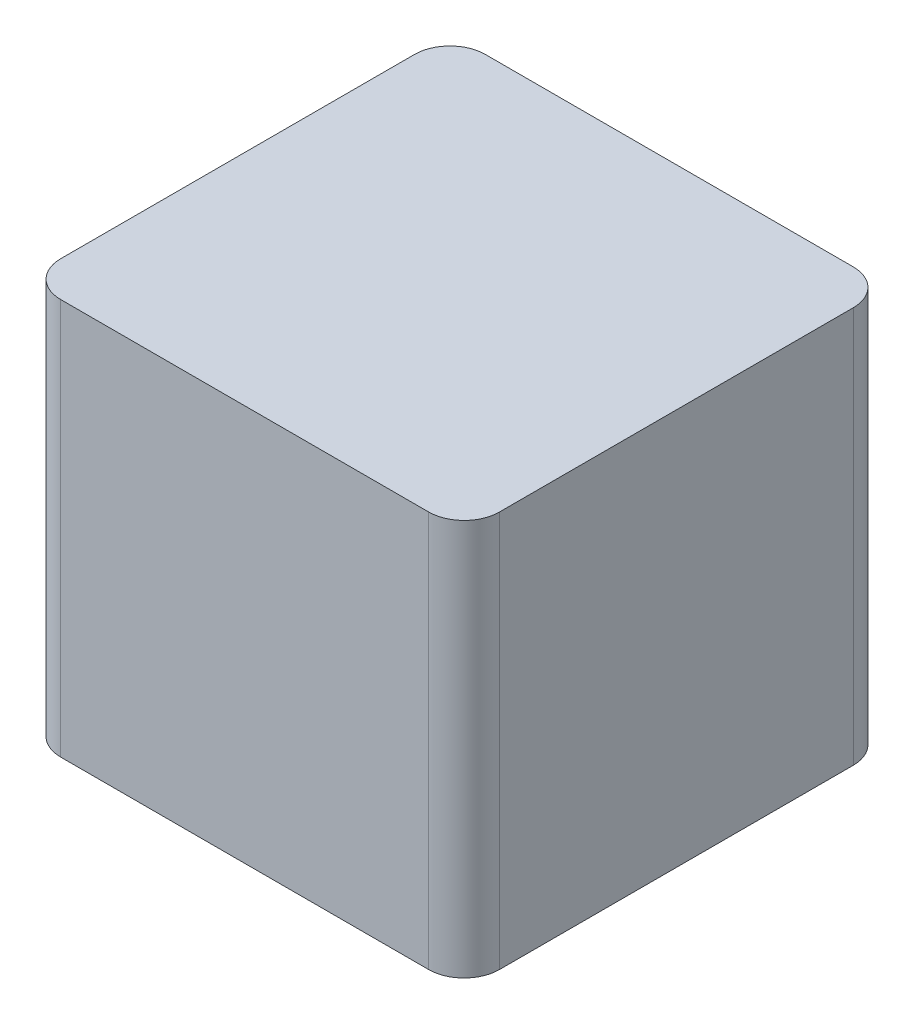
ISO-10303-21;
HEADER;
FILE_DESCRIPTION(('STEP AP214'),'2;1');
FILE_NAME('part.step','',(''),(''),'','','');
FILE_SCHEMA(('AUTOMOTIVE_DESIGN { 1 0 10303 214 1 1 1 1 }'));
ENDSEC;
DATA;
#1=APPLICATION_CONTEXT('core data for automotive mechanical design processes');
#2=APPLICATION_PROTOCOL_DEFINITION('international standard','automotive_design',2000,#1);
#3=PRODUCT_CONTEXT('',#1,'mechanical');
#4=PRODUCT('Part','Part','',(#3));
#5=PRODUCT_RELATED_PRODUCT_CATEGORY('part','',(#4));
#6=PRODUCT_DEFINITION_FORMATION('','',#4);
#7=PRODUCT_DEFINITION_CONTEXT('part definition',#1,'design');
#8=PRODUCT_DEFINITION('design','',#6,#7);
#9=PRODUCT_DEFINITION_SHAPE('','',#8);
#10=(LENGTH_UNIT() NAMED_UNIT(*) SI_UNIT(.MILLI.,.METRE.));
#11=(NAMED_UNIT(*) PLANE_ANGLE_UNIT() SI_UNIT($,.RADIAN.));
#12=(NAMED_UNIT(*) SI_UNIT($,.STERADIAN.) SOLID_ANGLE_UNIT());
#13=UNCERTAINTY_MEASURE_WITH_UNIT(LENGTH_MEASURE(1.E-05),#10,'distance_accuracy_value','');
#14=(GEOMETRIC_REPRESENTATION_CONTEXT(3) GLOBAL_UNCERTAINTY_ASSIGNED_CONTEXT((#13)) GLOBAL_UNIT_ASSIGNED_CONTEXT((#10,
#11,#12)) REPRESENTATION_CONTEXT('',''));
#15=CARTESIAN_POINT('',(0.,0.,0.));
#16=DIRECTION('',(0.,0.,1.));
#17=DIRECTION('',(1.,0.,0.));
#18=AXIS2_PLACEMENT_3D('',#15,#16,#17);
#19=CARTESIAN_POINT('',(-52.,-56.,50.));
#20=DIRECTION('',(0.,1.,0.));
#21=DIRECTION('',(0.,0.,1.));
#22=AXIS2_PLACEMENT_3D('',#19,#20,#21);
#23=CYLINDRICAL_SURFACE('',#22,10.);
#24=DIRECTION('',(0.,1.,0.));
#25=VECTOR('',#24,1.);
#26=CARTESIAN_POINT('',(-52.,-56.,60.));
#27=LINE('',#26,#25);
#28=CARTESIAN_POINT('',(-52.,-56.,60.));
#29=VERTEX_POINT('',#28);
#30=CARTESIAN_POINT('',(-52.,56.,60.));
#31=VERTEX_POINT('',#30);
#32=EDGE_CURVE('E42',#29,#31,#27,.T.);
#33=ORIENTED_EDGE('',*,*,#32,.T.);
#34=CARTESIAN_POINT('',(-52.,56.,50.));
#35=DIRECTION('',(0.,1.,0.));
#36=DIRECTION('',(0.,0.,-1.));
#37=AXIS2_PLACEMENT_3D('',#34,#35,#36);
#38=CIRCLE('',#37,10.);
#39=CARTESIAN_POINT('',(-62.,56.,50.));
#40=VERTEX_POINT('',#39);
#41=EDGE_CURVE('E104',#40,#31,#38,.T.);
#42=ORIENTED_EDGE('',*,*,#41,.F.);
#43=DIRECTION('',(0.,1.,0.));
#44=VECTOR('',#43,1.);
#45=CARTESIAN_POINT('',(-62.,-56.,50.));
#46=LINE('',#45,#44);
#47=CARTESIAN_POINT('',(-62.,-56.,50.));
#48=VERTEX_POINT('',#47);
#49=EDGE_CURVE('E11',#48,#40,#46,.T.);
#50=ORIENTED_EDGE('',*,*,#49,.F.);
#51=CARTESIAN_POINT('',(-52.,-56.,50.));
#52=DIRECTION('',(0.,1.,0.));
#53=DIRECTION('',(0.,0.,-1.));
#54=AXIS2_PLACEMENT_3D('',#51,#52,#53);
#55=CIRCLE('',#54,10.);
#56=EDGE_CURVE('E105',#48,#29,#55,.T.);
#57=ORIENTED_EDGE('',*,*,#56,.T.);
#58=EDGE_LOOP('',(#33,#42,#50,#57));
#59=FACE_BOUND('',#58,.T.);
#60=ADVANCED_FACE('F39',(#59),#23,.T.);
#61=CARTESIAN_POINT('',(-62.,-56.,50.));
#62=DIRECTION('',(-1.,0.,0.));
#63=DIRECTION('',(0.,0.,1.));
#64=AXIS2_PLACEMENT_3D('',#61,#62,#63);
#65=PLANE('',#64);
#66=ORIENTED_EDGE('',*,*,#49,.T.);
#67=DIRECTION('',(0.,0.,1.));
#68=VECTOR('',#67,1.);
#69=CARTESIAN_POINT('',(-62.,56.,50.));
#70=LINE('',#69,#68);
#71=CARTESIAN_POINT('',(-62.,56.,-50.));
#72=VERTEX_POINT('',#71);
#73=EDGE_CURVE('E124',#72,#40,#70,.T.);
#74=ORIENTED_EDGE('',*,*,#73,.F.);
#75=DIRECTION('',(0.,1.,0.));
#76=VECTOR('',#75,1.);
#77=CARTESIAN_POINT('',(-62.,-56.,-50.));
#78=LINE('',#77,#76);
#79=CARTESIAN_POINT('',(-62.,-56.,-50.));
#80=VERTEX_POINT('',#79);
#81=EDGE_CURVE('E48',#80,#72,#78,.T.);
#82=ORIENTED_EDGE('',*,*,#81,.F.);
#83=DIRECTION('',(0.,0.,1.));
#84=VECTOR('',#83,1.);
#85=CARTESIAN_POINT('',(-62.,-56.,50.));
#86=LINE('',#85,#84);
#87=EDGE_CURVE('E111',#80,#48,#86,.T.);
#88=ORIENTED_EDGE('',*,*,#87,.T.);
#89=EDGE_LOOP('',(#66,#74,#82,#88));
#90=FACE_BOUND('',#89,.T.);
#91=ADVANCED_FACE('F209',(#90),#65,.T.);
#92=CARTESIAN_POINT('',(-52.,-56.,-50.));
#93=DIRECTION('',(0.,1.,0.));
#94=DIRECTION('',(0.,0.,1.));
#95=AXIS2_PLACEMENT_3D('',#92,#93,#94);
#96=CYLINDRICAL_SURFACE('',#95,10.);
#97=ORIENTED_EDGE('',*,*,#81,.T.);
#98=CARTESIAN_POINT('',(-52.,56.,-50.));
#99=DIRECTION('',(0.,1.,0.));
#100=DIRECTION('',(0.,0.,-1.));
#101=AXIS2_PLACEMENT_3D('',#98,#99,#100);
#102=CIRCLE('',#101,10.);
#103=CARTESIAN_POINT('',(-52.,56.,-60.));
#104=VERTEX_POINT('',#103);
#105=EDGE_CURVE('E142',#104,#72,#102,.T.);
#106=ORIENTED_EDGE('',*,*,#105,.F.);
#107=DIRECTION('',(0.,1.,0.));
#108=VECTOR('',#107,1.);
#109=CARTESIAN_POINT('',(-52.,-56.,-60.));
#110=LINE('',#109,#108);
#111=CARTESIAN_POINT('',(-52.,-56.,-60.));
#112=VERTEX_POINT('',#111);
#113=EDGE_CURVE('E175',#112,#104,#110,.T.);
#114=ORIENTED_EDGE('',*,*,#113,.F.);
#115=CARTESIAN_POINT('',(-52.,-56.,-50.));
#116=DIRECTION('',(0.,1.,0.));
#117=DIRECTION('',(0.,0.,-1.));
#118=AXIS2_PLACEMENT_3D('',#115,#116,#117);
#119=CIRCLE('',#118,10.);
#120=EDGE_CURVE('E168',#112,#80,#119,.T.);
#121=ORIENTED_EDGE('',*,*,#120,.T.);
#122=EDGE_LOOP('',(#97,#106,#114,#121));
#123=FACE_BOUND('',#122,.T.);
#124=ADVANCED_FACE('F208',(#123),#96,.T.);
#125=CARTESIAN_POINT('',(-52.,-56.,-60.));
#126=DIRECTION('',(0.,0.,-1.));
#127=DIRECTION('',(-1.,0.,0.));
#128=AXIS2_PLACEMENT_3D('',#125,#126,#127);
#129=PLANE('',#128);
#130=ORIENTED_EDGE('',*,*,#113,.T.);
#131=DIRECTION('',(-1.,0.,0.));
#132=VECTOR('',#131,1.);
#133=CARTESIAN_POINT('',(-52.,56.,-60.));
#134=LINE('',#133,#132);
#135=CARTESIAN_POINT('',(52.,56.,-60.));
#136=VERTEX_POINT('',#135);
#137=EDGE_CURVE('E138',#136,#104,#134,.T.);
#138=ORIENTED_EDGE('',*,*,#137,.F.);
#139=DIRECTION('',(0.,1.,0.));
#140=VECTOR('',#139,1.);
#141=CARTESIAN_POINT('',(52.,-56.,-60.));
#142=LINE('',#141,#140);
#143=CARTESIAN_POINT('',(52.,-56.,-60.));
#144=VERTEX_POINT('',#143);
#145=EDGE_CURVE('E178',#144,#136,#142,.T.);
#146=ORIENTED_EDGE('',*,*,#145,.F.);
#147=DIRECTION('',(-1.,0.,0.));
#148=VECTOR('',#147,1.);
#149=CARTESIAN_POINT('',(-52.,-56.,-60.));
#150=LINE('',#149,#148);
#151=EDGE_CURVE('E164',#144,#112,#150,.T.);
#152=ORIENTED_EDGE('',*,*,#151,.T.);
#153=EDGE_LOOP('',(#130,#138,#146,#152));
#154=FACE_BOUND('',#153,.T.);
#155=ADVANCED_FACE('F204',(#154),#129,.T.);
#156=CARTESIAN_POINT('',(52.,-56.,-50.));
#157=DIRECTION('',(0.,1.,0.));
#158=DIRECTION('',(0.,0.,1.));
#159=AXIS2_PLACEMENT_3D('',#156,#157,#158);
#160=CYLINDRICAL_SURFACE('',#159,10.);
#161=ORIENTED_EDGE('',*,*,#145,.T.);
#162=CARTESIAN_POINT('',(52.,56.,-50.));
#163=DIRECTION('',(0.,1.,0.));
#164=DIRECTION('',(0.,0.,-1.));
#165=AXIS2_PLACEMENT_3D('',#162,#163,#164);
#166=CIRCLE('',#165,10.);
#167=CARTESIAN_POINT('',(62.,56.,-50.));
#168=VERTEX_POINT('',#167);
#169=EDGE_CURVE('E134',#168,#136,#166,.T.);
#170=ORIENTED_EDGE('',*,*,#169,.F.);
#171=DIRECTION('',(0.,1.,0.));
#172=VECTOR('',#171,1.);
#173=CARTESIAN_POINT('',(62.,-56.,-50.));
#174=LINE('',#173,#172);
#175=CARTESIAN_POINT('',(62.,-56.,-50.));
#176=VERTEX_POINT('',#175);
#177=EDGE_CURVE('E181',#176,#168,#174,.T.);
#178=ORIENTED_EDGE('',*,*,#177,.F.);
#179=CARTESIAN_POINT('',(52.,-56.,-50.));
#180=DIRECTION('',(0.,1.,0.));
#181=DIRECTION('',(0.,0.,-1.));
#182=AXIS2_PLACEMENT_3D('',#179,#180,#181);
#183=CIRCLE('',#182,10.);
#184=EDGE_CURVE('E160',#176,#144,#183,.T.);
#185=ORIENTED_EDGE('',*,*,#184,.T.);
#186=EDGE_LOOP('',(#161,#170,#178,#185));
#187=FACE_BOUND('',#186,.T.);
#188=ADVANCED_FACE('F197',(#187),#160,.T.);
#189=CARTESIAN_POINT('',(62.,-56.,50.));
#190=DIRECTION('',(1.,0.,0.));
#191=DIRECTION('',(0.,0.,-1.));
#192=AXIS2_PLACEMENT_3D('',#189,#190,#191);
#193=PLANE('',#192);
#194=ORIENTED_EDGE('',*,*,#177,.T.);
#195=DIRECTION('',(0.,0.,-1.));
#196=VECTOR('',#195,1.);
#197=CARTESIAN_POINT('',(62.,56.,50.));
#198=LINE('',#197,#196);
#199=CARTESIAN_POINT('',(62.,56.,50.));
#200=VERTEX_POINT('',#199);
#201=EDGE_CURVE('E130',#200,#168,#198,.T.);
#202=ORIENTED_EDGE('',*,*,#201,.F.);
#203=DIRECTION('',(0.,1.,0.));
#204=VECTOR('',#203,1.);
#205=CARTESIAN_POINT('',(62.,-56.,50.));
#206=LINE('',#205,#204);
#207=CARTESIAN_POINT('',(62.,-56.,50.));
#208=VERTEX_POINT('',#207);
#209=EDGE_CURVE('E184',#208,#200,#206,.T.);
#210=ORIENTED_EDGE('',*,*,#209,.F.);
#211=DIRECTION('',(0.,0.,-1.));
#212=VECTOR('',#211,1.);
#213=CARTESIAN_POINT('',(62.,-56.,50.));
#214=LINE('',#213,#212);
#215=EDGE_CURVE('E156',#208,#176,#214,.T.);
#216=ORIENTED_EDGE('',*,*,#215,.T.);
#217=EDGE_LOOP('',(#194,#202,#210,#216));
#218=FACE_BOUND('',#217,.T.);
#219=ADVANCED_FACE('F194',(#218),#193,.T.);
#220=CARTESIAN_POINT('',(52.,-56.,50.));
#221=DIRECTION('',(0.,1.,0.));
#222=DIRECTION('',(0.,0.,1.));
#223=AXIS2_PLACEMENT_3D('',#220,#221,#222);
#224=CYLINDRICAL_SURFACE('',#223,10.);
#225=ORIENTED_EDGE('',*,*,#209,.T.);
#226=CARTESIAN_POINT('',(52.,56.,50.));
#227=DIRECTION('',(0.,1.,0.));
#228=DIRECTION('',(0.,0.,1.));
#229=AXIS2_PLACEMENT_3D('',#226,#227,#228);
#230=CIRCLE('',#229,10.);
#231=CARTESIAN_POINT('',(52.,56.,60.));
#232=VERTEX_POINT('',#231);
#233=EDGE_CURVE('E119',#232,#200,#230,.T.);
#234=ORIENTED_EDGE('',*,*,#233,.F.);
#235=DIRECTION('',(0.,1.,0.));
#236=VECTOR('',#235,1.);
#237=CARTESIAN_POINT('',(52.,-56.,60.));
#238=LINE('',#237,#236);
#239=CARTESIAN_POINT('',(52.,-56.,60.));
#240=VERTEX_POINT('',#239);
#241=EDGE_CURVE('E110',#240,#232,#238,.T.);
#242=ORIENTED_EDGE('',*,*,#241,.F.);
#243=CARTESIAN_POINT('',(52.,-56.,50.));
#244=DIRECTION('',(0.,1.,0.));
#245=DIRECTION('',(0.,0.,1.));
#246=AXIS2_PLACEMENT_3D('',#243,#244,#245);
#247=CIRCLE('',#246,10.);
#248=EDGE_CURVE('E152',#240,#208,#247,.T.);
#249=ORIENTED_EDGE('',*,*,#248,.T.);
#250=EDGE_LOOP('',(#225,#234,#242,#249));
#251=FACE_BOUND('',#250,.T.);
#252=ADVANCED_FACE('F188',(#251),#224,.T.);
#253=CARTESIAN_POINT('',(-52.,-56.,60.));
#254=DIRECTION('',(0.,0.,1.));
#255=DIRECTION('',(1.,0.,0.));
#256=AXIS2_PLACEMENT_3D('',#253,#254,#255);
#257=PLANE('',#256);
#258=ORIENTED_EDGE('',*,*,#241,.T.);
#259=DIRECTION('',(1.,0.,0.));
#260=VECTOR('',#259,1.);
#261=CARTESIAN_POINT('',(-52.,56.,60.));
#262=LINE('',#261,#260);
#263=EDGE_CURVE('E113',#31,#232,#262,.T.);
#264=ORIENTED_EDGE('',*,*,#263,.F.);
#265=ORIENTED_EDGE('',*,*,#32,.F.);
#266=DIRECTION('',(1.,0.,0.));
#267=VECTOR('',#266,1.);
#268=CARTESIAN_POINT('',(-52.,-56.,60.));
#269=LINE('',#268,#267);
#270=EDGE_CURVE('E149',#29,#240,#269,.T.);
#271=ORIENTED_EDGE('',*,*,#270,.T.);
#272=EDGE_LOOP('',(#258,#264,#265,#271));
#273=FACE_BOUND('',#272,.T.);
#274=ADVANCED_FACE('F114',(#273),#257,.T.);
#275=CARTESIAN_POINT('',(-52.,-56.,50.));
#276=DIRECTION('',(0.,-1.,0.));
#277=DIRECTION('',(0.,0.,-1.));
#278=AXIS2_PLACEMENT_3D('',#275,#276,#277);
#279=PLANE('',#278);
#280=ORIENTED_EDGE('',*,*,#56,.F.);
#281=ORIENTED_EDGE('',*,*,#87,.F.);
#282=ORIENTED_EDGE('',*,*,#120,.F.);
#283=ORIENTED_EDGE('',*,*,#151,.F.);
#284=ORIENTED_EDGE('',*,*,#184,.F.);
#285=ORIENTED_EDGE('',*,*,#215,.F.);
#286=ORIENTED_EDGE('',*,*,#248,.F.);
#287=ORIENTED_EDGE('',*,*,#270,.F.);
#288=EDGE_LOOP('',(#280,#281,#282,#283,#284,#285,#286,#287));
#289=FACE_BOUND('',#288,.T.);
#290=ADVANCED_FACE('F200',(#289),#279,.T.);
#291=CARTESIAN_POINT('',(-52.,56.,50.));
#292=DIRECTION('',(0.,-1.,0.));
#293=DIRECTION('',(0.,0.,-1.));
#294=AXIS2_PLACEMENT_3D('',#291,#292,#293);
#295=PLANE('',#294);
#296=ORIENTED_EDGE('',*,*,#41,.T.);
#297=ORIENTED_EDGE('',*,*,#263,.T.);
#298=ORIENTED_EDGE('',*,*,#233,.T.);
#299=ORIENTED_EDGE('',*,*,#201,.T.);
#300=ORIENTED_EDGE('',*,*,#169,.T.);
#301=ORIENTED_EDGE('',*,*,#137,.T.);
#302=ORIENTED_EDGE('',*,*,#105,.T.);
#303=ORIENTED_EDGE('',*,*,#73,.T.);
#304=EDGE_LOOP('',(#296,#297,#298,#299,#300,#301,#302,#303));
#305=FACE_BOUND('',#304,.T.);
#306=ADVANCED_FACE('F122',(#305),#295,.F.);
#307=CLOSED_SHELL('',(#60,#91,#124,#155,#188,#219,#252,#274,#290,#306));
#308=MANIFOLD_SOLID_BREP('B2',#307);
#309=ADVANCED_BREP_SHAPE_REPRESENTATION('',(#18,#308),#14);
#310=SHAPE_DEFINITION_REPRESENTATION(#9,#309);
ENDSEC;
END-ISO-10303-21;
